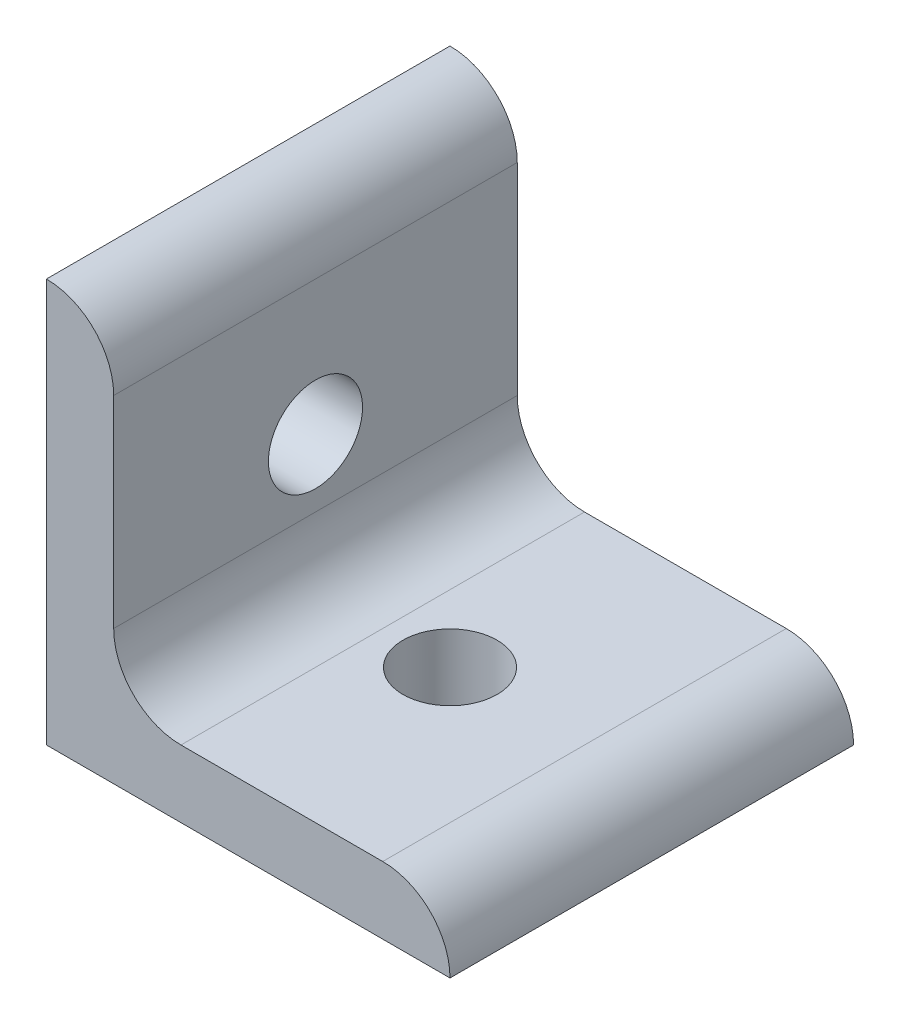
ISO-10303-21;
HEADER;
FILE_DESCRIPTION(('STEP AP214'),'2;1');
FILE_NAME('part.step','',(''),(''),'','','');
FILE_SCHEMA(('AUTOMOTIVE_DESIGN { 1 0 10303 214 1 1 1 1 }'));
ENDSEC;
DATA;
#1=APPLICATION_CONTEXT('core data for automotive mechanical design processes');
#2=APPLICATION_PROTOCOL_DEFINITION('international standard','automotive_design',2000,#1);
#3=PRODUCT_CONTEXT('',#1,'mechanical');
#4=PRODUCT('Part','Part','',(#3));
#5=PRODUCT_RELATED_PRODUCT_CATEGORY('part','',(#4));
#6=PRODUCT_DEFINITION_FORMATION('','',#4);
#7=PRODUCT_DEFINITION_CONTEXT('part definition',#1,'design');
#8=PRODUCT_DEFINITION('design','',#6,#7);
#9=PRODUCT_DEFINITION_SHAPE('','',#8);
#10=(LENGTH_UNIT() NAMED_UNIT(*) SI_UNIT(.MILLI.,.METRE.));
#11=(NAMED_UNIT(*) PLANE_ANGLE_UNIT() SI_UNIT($,.RADIAN.));
#12=(NAMED_UNIT(*) SI_UNIT($,.STERADIAN.) SOLID_ANGLE_UNIT());
#13=UNCERTAINTY_MEASURE_WITH_UNIT(LENGTH_MEASURE(1.E-05),#10,'distance_accuracy_value','');
#14=(GEOMETRIC_REPRESENTATION_CONTEXT(3) GLOBAL_UNCERTAINTY_ASSIGNED_CONTEXT((#13)) GLOBAL_UNIT_ASSIGNED_CONTEXT((#10,
#11,#12)) REPRESENTATION_CONTEXT('',''));
#15=CARTESIAN_POINT('',(0.,0.,0.));
#16=DIRECTION('',(0.,0.,1.));
#17=DIRECTION('',(1.,0.,0.));
#18=AXIS2_PLACEMENT_3D('',#15,#16,#17);
#19=CARTESIAN_POINT('',(5.,25.,15.));
#20=DIRECTION('',(-1.,0.,0.));
#21=DIRECTION('',(0.,-1.,0.));
#22=AXIS2_PLACEMENT_3D('',#19,#20,#21);
#23=PLANE('',#22);
#24=DIRECTION('',(0.,1.,0.));
#25=VECTOR('',#24,1.);
#26=CARTESIAN_POINT('',(5.,25.,-15.));
#27=LINE('',#26,#25);
#28=CARTESIAN_POINT('',(5.,10.,-15.));
#29=VERTEX_POINT('',#28);
#30=CARTESIAN_POINT('',(5.,25.,-15.));
#31=VERTEX_POINT('',#30);
#32=EDGE_CURVE('E138',#29,#31,#27,.T.);
#33=ORIENTED_EDGE('',*,*,#32,.T.);
#34=DIRECTION('',(0.,0.,-1.));
#35=VECTOR('',#34,1.);
#36=CARTESIAN_POINT('',(5.,25.,15.));
#37=LINE('',#36,#35);
#38=CARTESIAN_POINT('',(5.,25.,15.));
#39=VERTEX_POINT('',#38);
#40=EDGE_CURVE('E135',#39,#31,#37,.T.);
#41=ORIENTED_EDGE('',*,*,#40,.F.);
#42=DIRECTION('',(0.,1.,0.));
#43=VECTOR('',#42,1.);
#44=CARTESIAN_POINT('',(5.,25.,15.));
#45=LINE('',#44,#43);
#46=CARTESIAN_POINT('',(5.,10.,15.));
#47=VERTEX_POINT('',#46);
#48=EDGE_CURVE('E123',#47,#39,#45,.T.);
#49=ORIENTED_EDGE('',*,*,#48,.F.);
#50=DIRECTION('',(0.,0.,-1.));
#51=VECTOR('',#50,1.);
#52=CARTESIAN_POINT('',(5.,10.,15.));
#53=LINE('',#52,#51);
#54=EDGE_CURVE('E140',#47,#29,#53,.T.);
#55=ORIENTED_EDGE('',*,*,#54,.T.);
#56=EDGE_LOOP('',(#33,#41,#49,#55));
#57=FACE_BOUND('',#56,.T.);
#58=CARTESIAN_POINT('',(5.,15.,0.));
#59=DIRECTION('',(-1.,0.,0.));
#60=DIRECTION('',(0.,-1.,0.));
#61=AXIS2_PLACEMENT_3D('',#58,#59,#60);
#62=CIRCLE('',#61,3.5);
#63=CARTESIAN_POINT('',(5.,11.5,0.));
#64=VERTEX_POINT('',#63);
#65=EDGE_CURVE('E208',#64,#64,#62,.F.);
#66=ORIENTED_EDGE('',*,*,#65,.F.);
#67=EDGE_LOOP('',(#66));
#68=FACE_BOUND('',#67,.T.);
#69=ADVANCED_FACE('F40',(#57,#68),#23,.F.);
#70=CARTESIAN_POINT('',(0.,0.,15.));
#71=DIRECTION('',(1.,0.,0.));
#72=DIRECTION('',(0.,0.,-1.));
#73=AXIS2_PLACEMENT_3D('',#70,#71,#72);
#74=PLANE('',#73);
#75=DIRECTION('',(0.,-1.,0.));
#76=VECTOR('',#75,1.);
#77=CARTESIAN_POINT('',(0.,0.,-15.));
#78=LINE('',#77,#76);
#79=CARTESIAN_POINT('',(0.,30.,-15.));
#80=VERTEX_POINT('',#79);
#81=CARTESIAN_POINT('',(0.,0.,-15.));
#82=VERTEX_POINT('',#81);
#83=EDGE_CURVE('E101',#80,#82,#78,.T.);
#84=ORIENTED_EDGE('',*,*,#83,.T.);
#85=DIRECTION('',(0.,0.,-1.));
#86=VECTOR('',#85,1.);
#87=CARTESIAN_POINT('',(0.,0.,15.));
#88=LINE('',#87,#86);
#89=CARTESIAN_POINT('',(0.,0.,15.));
#90=VERTEX_POINT('',#89);
#91=EDGE_CURVE('E149',#90,#82,#88,.T.);
#92=ORIENTED_EDGE('',*,*,#91,.F.);
#93=DIRECTION('',(0.,-1.,0.));
#94=VECTOR('',#93,1.);
#95=CARTESIAN_POINT('',(0.,0.,15.));
#96=LINE('',#95,#94);
#97=CARTESIAN_POINT('',(0.,30.,15.));
#98=VERTEX_POINT('',#97);
#99=EDGE_CURVE('E62',#98,#90,#96,.T.);
#100=ORIENTED_EDGE('',*,*,#99,.F.);
#101=DIRECTION('',(0.,0.,-1.));
#102=VECTOR('',#101,1.);
#103=CARTESIAN_POINT('',(0.,30.,15.));
#104=LINE('',#103,#102);
#105=EDGE_CURVE('E141',#98,#80,#104,.T.);
#106=ORIENTED_EDGE('',*,*,#105,.T.);
#107=EDGE_LOOP('',(#84,#92,#100,#106));
#108=FACE_BOUND('',#107,.T.);
#109=CARTESIAN_POINT('',(0.,15.,0.));
#110=DIRECTION('',(1.,0.,0.));
#111=DIRECTION('',(0.,0.,-1.));
#112=AXIS2_PLACEMENT_3D('',#109,#110,#111);
#113=CIRCLE('',#112,3.5);
#114=CARTESIAN_POINT('',(0.,15.,-3.5));
#115=VERTEX_POINT('',#114);
#116=EDGE_CURVE('E212',#115,#115,#113,.T.);
#117=ORIENTED_EDGE('',*,*,#116,.T.);
#118=EDGE_LOOP('',(#117));
#119=FACE_BOUND('',#118,.T.);
#120=ADVANCED_FACE('F217',(#108,#119),#74,.F.);
#121=CARTESIAN_POINT('',(30.,0.,15.));
#122=DIRECTION('',(0.,1.,0.));
#123=DIRECTION('',(-1.,0.,0.));
#124=AXIS2_PLACEMENT_3D('',#121,#122,#123);
#125=PLANE('',#124);
#126=DIRECTION('',(1.,0.,0.));
#127=VECTOR('',#126,1.);
#128=CARTESIAN_POINT('',(30.,0.,-15.));
#129=LINE('',#128,#127);
#130=CARTESIAN_POINT('',(30.,0.,-15.));
#131=VERTEX_POINT('',#130);
#132=EDGE_CURVE('E153',#82,#131,#129,.T.);
#133=ORIENTED_EDGE('',*,*,#132,.T.);
#134=DIRECTION('',(0.,0.,-1.));
#135=VECTOR('',#134,1.);
#136=CARTESIAN_POINT('',(30.,0.,15.));
#137=LINE('',#136,#135);
#138=CARTESIAN_POINT('',(30.,0.,15.));
#139=VERTEX_POINT('',#138);
#140=EDGE_CURVE('E11',#139,#131,#137,.T.);
#141=ORIENTED_EDGE('',*,*,#140,.F.);
#142=DIRECTION('',(1.,0.,0.));
#143=VECTOR('',#142,1.);
#144=CARTESIAN_POINT('',(30.,0.,15.));
#145=LINE('',#144,#143);
#146=EDGE_CURVE('E171',#90,#139,#145,.T.);
#147=ORIENTED_EDGE('',*,*,#146,.F.);
#148=ORIENTED_EDGE('',*,*,#91,.T.);
#149=EDGE_LOOP('',(#133,#141,#147,#148));
#150=FACE_BOUND('',#149,.T.);
#151=CARTESIAN_POINT('',(15.,0.,0.));
#152=DIRECTION('',(0.,1.,0.));
#153=DIRECTION('',(0.,0.,1.));
#154=AXIS2_PLACEMENT_3D('',#151,#152,#153);
#155=CIRCLE('',#154,3.5);
#156=CARTESIAN_POINT('',(15.,0.,3.5));
#157=VERTEX_POINT('',#156);
#158=EDGE_CURVE('E204',#157,#157,#155,.T.);
#159=ORIENTED_EDGE('',*,*,#158,.T.);
#160=EDGE_LOOP('',(#159));
#161=FACE_BOUND('',#160,.T.);
#162=ADVANCED_FACE('F42',(#150,#161),#125,.F.);
#163=CARTESIAN_POINT('',(10.,5.,15.));
#164=DIRECTION('',(0.,-1.,0.));
#165=DIRECTION('',(1.,0.,0.));
#166=AXIS2_PLACEMENT_3D('',#163,#164,#165);
#167=PLANE('',#166);
#168=DIRECTION('',(-1.,0.,0.));
#169=VECTOR('',#168,1.);
#170=CARTESIAN_POINT('',(10.,5.,-15.));
#171=LINE('',#170,#169);
#172=CARTESIAN_POINT('',(25.,5.,-15.));
#173=VERTEX_POINT('',#172);
#174=CARTESIAN_POINT('',(10.,5.,-15.));
#175=VERTEX_POINT('',#174);
#176=EDGE_CURVE('E159',#173,#175,#171,.T.);
#177=ORIENTED_EDGE('',*,*,#176,.T.);
#178=DIRECTION('',(0.,0.,-1.));
#179=VECTOR('',#178,1.);
#180=CARTESIAN_POINT('',(10.,5.,15.));
#181=LINE('',#180,#179);
#182=CARTESIAN_POINT('',(10.,5.,15.));
#183=VERTEX_POINT('',#182);
#184=EDGE_CURVE('E177',#183,#175,#181,.T.);
#185=ORIENTED_EDGE('',*,*,#184,.F.);
#186=DIRECTION('',(-1.,0.,0.));
#187=VECTOR('',#186,1.);
#188=CARTESIAN_POINT('',(10.,5.,15.));
#189=LINE('',#188,#187);
#190=CARTESIAN_POINT('',(25.,5.,15.));
#191=VERTEX_POINT('',#190);
#192=EDGE_CURVE('E190',#191,#183,#189,.T.);
#193=ORIENTED_EDGE('',*,*,#192,.F.);
#194=DIRECTION('',(0.,0.,-1.));
#195=VECTOR('',#194,1.);
#196=CARTESIAN_POINT('',(25.,5.,15.));
#197=LINE('',#196,#195);
#198=EDGE_CURVE('E51',#191,#173,#197,.T.);
#199=ORIENTED_EDGE('',*,*,#198,.T.);
#200=EDGE_LOOP('',(#177,#185,#193,#199));
#201=FACE_BOUND('',#200,.T.);
#202=CARTESIAN_POINT('',(15.,5.,0.));
#203=DIRECTION('',(0.,-1.,0.));
#204=DIRECTION('',(1.,0.,0.));
#205=AXIS2_PLACEMENT_3D('',#202,#203,#204);
#206=CIRCLE('',#205,3.5);
#207=CARTESIAN_POINT('',(18.5,5.,0.));
#208=VERTEX_POINT('',#207);
#209=EDGE_CURVE('E44',#208,#208,#206,.F.);
#210=ORIENTED_EDGE('',*,*,#209,.F.);
#211=EDGE_LOOP('',(#210));
#212=FACE_BOUND('',#211,.T.);
#213=ADVANCED_FACE('F187',(#201,#212),#167,.F.);
#214=CARTESIAN_POINT('',(25.,0.,15.));
#215=DIRECTION('',(0.,0.,-1.));
#216=DIRECTION('',(-1.,0.,0.));
#217=AXIS2_PLACEMENT_3D('',#214,#215,#216);
#218=CYLINDRICAL_SURFACE('',#217,5.);
#219=CARTESIAN_POINT('',(25.,0.,-15.));
#220=DIRECTION('',(0.,0.,1.));
#221=DIRECTION('',(1.,0.,0.));
#222=AXIS2_PLACEMENT_3D('',#219,#220,#221);
#223=CIRCLE('',#222,5.);
#224=EDGE_CURVE('E156',#131,#173,#223,.T.);
#225=ORIENTED_EDGE('',*,*,#224,.T.);
#226=ORIENTED_EDGE('',*,*,#198,.F.);
#227=CARTESIAN_POINT('',(25.,0.,15.));
#228=DIRECTION('',(0.,0.,1.));
#229=DIRECTION('',(1.,0.,0.));
#230=AXIS2_PLACEMENT_3D('',#227,#228,#229);
#231=CIRCLE('',#230,5.);
#232=EDGE_CURVE('E110',#139,#191,#231,.T.);
#233=ORIENTED_EDGE('',*,*,#232,.F.);
#234=ORIENTED_EDGE('',*,*,#140,.T.);
#235=EDGE_LOOP('',(#225,#226,#233,#234));
#236=FACE_BOUND('',#235,.T.);
#237=ADVANCED_FACE('F235',(#236),#218,.T.);
#238=CARTESIAN_POINT('',(10.,10.,15.));
#239=DIRECTION('',(0.,0.,-1.));
#240=DIRECTION('',(-1.,0.,0.));
#241=AXIS2_PLACEMENT_3D('',#238,#239,#240);
#242=CYLINDRICAL_SURFACE('',#241,5.);
#243=CARTESIAN_POINT('',(10.,10.,-15.));
#244=DIRECTION('',(0.,0.,-1.));
#245=DIRECTION('',(1.,0.,0.));
#246=AXIS2_PLACEMENT_3D('',#243,#244,#245);
#247=CIRCLE('',#246,5.);
#248=EDGE_CURVE('E162',#175,#29,#247,.T.);
#249=ORIENTED_EDGE('',*,*,#248,.T.);
#250=ORIENTED_EDGE('',*,*,#54,.F.);
#251=CARTESIAN_POINT('',(10.,10.,15.));
#252=DIRECTION('',(0.,0.,-1.));
#253=DIRECTION('',(1.,0.,0.));
#254=AXIS2_PLACEMENT_3D('',#251,#252,#253);
#255=CIRCLE('',#254,5.);
#256=EDGE_CURVE('E129',#183,#47,#255,.T.);
#257=ORIENTED_EDGE('',*,*,#256,.F.);
#258=ORIENTED_EDGE('',*,*,#184,.T.);
#259=EDGE_LOOP('',(#249,#250,#257,#258));
#260=FACE_BOUND('',#259,.T.);
#261=ADVANCED_FACE('F196',(#260),#242,.F.);
#262=CARTESIAN_POINT('',(0.,25.,15.));
#263=DIRECTION('',(0.,0.,-1.));
#264=DIRECTION('',(-1.,0.,0.));
#265=AXIS2_PLACEMENT_3D('',#262,#263,#264);
#266=CYLINDRICAL_SURFACE('',#265,5.);
#267=CARTESIAN_POINT('',(0.,25.,-15.));
#268=DIRECTION('',(0.,0.,1.));
#269=DIRECTION('',(1.,0.,0.));
#270=AXIS2_PLACEMENT_3D('',#267,#268,#269);
#271=CIRCLE('',#270,5.);
#272=EDGE_CURVE('E95',#31,#80,#271,.T.);
#273=ORIENTED_EDGE('',*,*,#272,.T.);
#274=ORIENTED_EDGE('',*,*,#105,.F.);
#275=CARTESIAN_POINT('',(0.,25.,15.));
#276=DIRECTION('',(0.,0.,1.));
#277=DIRECTION('',(1.,0.,0.));
#278=AXIS2_PLACEMENT_3D('',#275,#276,#277);
#279=CIRCLE('',#278,5.);
#280=EDGE_CURVE('E127',#39,#98,#279,.T.);
#281=ORIENTED_EDGE('',*,*,#280,.F.);
#282=ORIENTED_EDGE('',*,*,#40,.T.);
#283=EDGE_LOOP('',(#273,#274,#281,#282));
#284=FACE_BOUND('',#283,.T.);
#285=ADVANCED_FACE('F143',(#284),#266,.T.);
#286=CARTESIAN_POINT('',(0.,25.,15.));
#287=DIRECTION('',(0.,0.,1.));
#288=DIRECTION('',(1.,0.,0.));
#289=AXIS2_PLACEMENT_3D('',#286,#287,#288);
#290=PLANE('',#289);
#291=ORIENTED_EDGE('',*,*,#146,.T.);
#292=ORIENTED_EDGE('',*,*,#232,.T.);
#293=ORIENTED_EDGE('',*,*,#192,.T.);
#294=ORIENTED_EDGE('',*,*,#256,.T.);
#295=ORIENTED_EDGE('',*,*,#48,.T.);
#296=ORIENTED_EDGE('',*,*,#280,.T.);
#297=ORIENTED_EDGE('',*,*,#99,.T.);
#298=EDGE_LOOP('',(#291,#292,#293,#294,#295,#296,#297));
#299=FACE_BOUND('',#298,.T.);
#300=ADVANCED_FACE('F125',(#299),#290,.T.);
#301=CARTESIAN_POINT('',(0.,25.,-15.));
#302=DIRECTION('',(0.,0.,1.));
#303=DIRECTION('',(1.,0.,0.));
#304=AXIS2_PLACEMENT_3D('',#301,#302,#303);
#305=PLANE('',#304);
#306=ORIENTED_EDGE('',*,*,#132,.F.);
#307=ORIENTED_EDGE('',*,*,#83,.F.);
#308=ORIENTED_EDGE('',*,*,#272,.F.);
#309=ORIENTED_EDGE('',*,*,#32,.F.);
#310=ORIENTED_EDGE('',*,*,#248,.F.);
#311=ORIENTED_EDGE('',*,*,#176,.F.);
#312=ORIENTED_EDGE('',*,*,#224,.F.);
#313=EDGE_LOOP('',(#306,#307,#308,#309,#310,#311,#312));
#314=FACE_BOUND('',#313,.T.);
#315=ADVANCED_FACE('F194',(#314),#305,.F.);
#316=CARTESIAN_POINT('',(15.,30.,0.));
#317=DIRECTION('',(0.,-1.,0.));
#318=DIRECTION('',(0.,0.,-1.));
#319=AXIS2_PLACEMENT_3D('',#316,#317,#318);
#320=CYLINDRICAL_SURFACE('',#319,3.5);
#321=ORIENTED_EDGE('',*,*,#158,.F.);
#322=EDGE_LOOP('',(#321));
#323=FACE_BOUND('',#322,.T.);
#324=ORIENTED_EDGE('',*,*,#209,.T.);
#325=EDGE_LOOP('',(#324));
#326=FACE_BOUND('',#325,.T.);
#327=ADVANCED_FACE('F222',(#323,#326),#320,.F.);
#328=CARTESIAN_POINT('',(30.,15.,0.));
#329=DIRECTION('',(-1.,0.,0.));
#330=DIRECTION('',(0.,0.,1.));
#331=AXIS2_PLACEMENT_3D('',#328,#329,#330);
#332=CYLINDRICAL_SURFACE('',#331,3.5);
#333=ORIENTED_EDGE('',*,*,#116,.F.);
#334=EDGE_LOOP('',(#333));
#335=FACE_BOUND('',#334,.T.);
#336=ORIENTED_EDGE('',*,*,#65,.T.);
#337=EDGE_LOOP('',(#336));
#338=FACE_BOUND('',#337,.T.);
#339=ADVANCED_FACE('F219',(#335,#338),#332,.F.);
#340=CLOSED_SHELL('',(#69,#120,#162,#213,#237,#261,#285,#300,#315,#327,#339));
#341=MANIFOLD_SOLID_BREP('B2',#340);
#342=ADVANCED_BREP_SHAPE_REPRESENTATION('',(#18,#341),#14);
#343=SHAPE_DEFINITION_REPRESENTATION(#9,#342);
ENDSEC;
END-ISO-10303-21;
